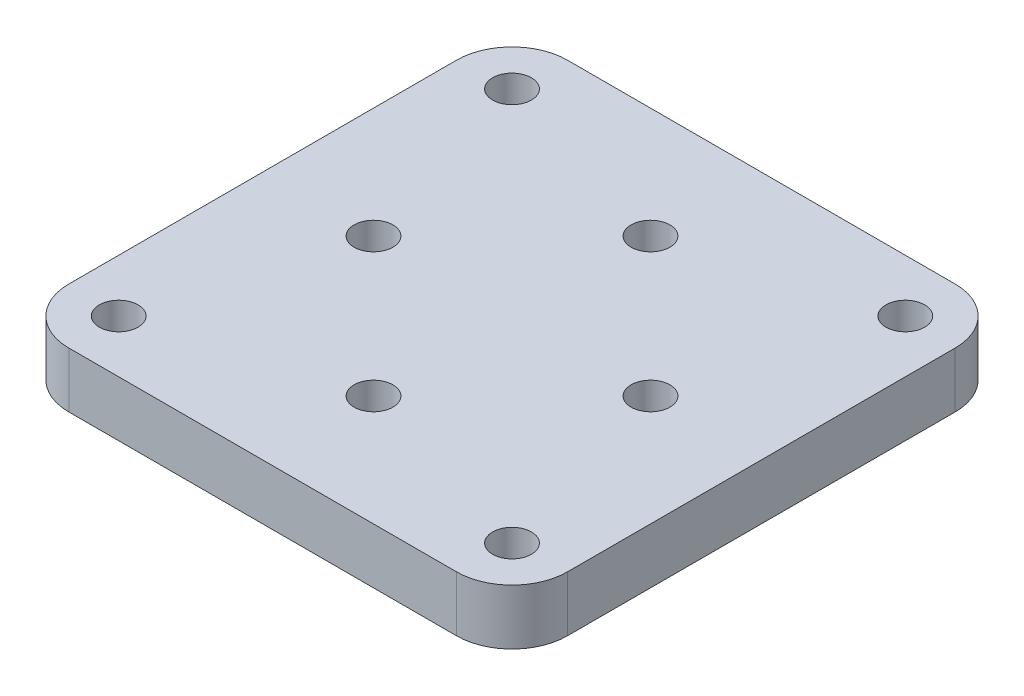
ISO-10303-21;
HEADER;
FILE_DESCRIPTION(('STEP AP214'),'2;1');
FILE_NAME('part.step','',(''),(''),'','','');
FILE_SCHEMA(('AUTOMOTIVE_DESIGN { 1 0 10303 214 1 1 1 1 }'));
ENDSEC;
DATA;
#1=APPLICATION_CONTEXT('core data for automotive mechanical design processes');
#2=APPLICATION_PROTOCOL_DEFINITION('international standard','automotive_design',2000,#1);
#3=PRODUCT_CONTEXT('',#1,'mechanical');
#4=PRODUCT('Part','Part','',(#3));
#5=PRODUCT_RELATED_PRODUCT_CATEGORY('part','',(#4));
#6=PRODUCT_DEFINITION_FORMATION('','',#4);
#7=PRODUCT_DEFINITION_CONTEXT('part definition',#1,'design');
#8=PRODUCT_DEFINITION('design','',#6,#7);
#9=PRODUCT_DEFINITION_SHAPE('','',#8);
#10=(LENGTH_UNIT() NAMED_UNIT(*) SI_UNIT(.MILLI.,.METRE.));
#11=(NAMED_UNIT(*) PLANE_ANGLE_UNIT() SI_UNIT($,.RADIAN.));
#12=(NAMED_UNIT(*) SI_UNIT($,.STERADIAN.) SOLID_ANGLE_UNIT());
#13=UNCERTAINTY_MEASURE_WITH_UNIT(LENGTH_MEASURE(1.E-05),#10,'distance_accuracy_value','');
#14=(GEOMETRIC_REPRESENTATION_CONTEXT(3) GLOBAL_UNCERTAINTY_ASSIGNED_CONTEXT((#13)) GLOBAL_UNIT_ASSIGNED_CONTEXT((#10,
#11,#12)) REPRESENTATION_CONTEXT('',''));
#15=CARTESIAN_POINT('',(0.,0.,0.));
#16=DIRECTION('',(0.,0.,1.));
#17=DIRECTION('',(1.,0.,0.));
#18=AXIS2_PLACEMENT_3D('',#15,#16,#17);
#19=CARTESIAN_POINT('',(45.,10.,-45.));
#20=DIRECTION('',(-1.,0.,0.));
#21=DIRECTION('',(0.,0.,1.));
#22=AXIS2_PLACEMENT_3D('',#19,#20,#21);
#23=PLANE('',#22);
#24=DIRECTION('',(0.,0.,-1.));
#25=VECTOR('',#24,1.);
#26=CARTESIAN_POINT('',(45.,0.,-45.));
#27=LINE('',#26,#25);
#28=CARTESIAN_POINT('',(45.,0.,35.));
#29=VERTEX_POINT('',#28);
#30=CARTESIAN_POINT('',(45.,0.,-35.));
#31=VERTEX_POINT('',#30);
#32=EDGE_CURVE('E130',#29,#31,#27,.T.);
#33=ORIENTED_EDGE('',*,*,#32,.T.);
#34=DIRECTION('',(0.,-1.,0.));
#35=VECTOR('',#34,1.);
#36=CARTESIAN_POINT('',(45.,10.,-35.));
#37=LINE('',#36,#35);
#38=CARTESIAN_POINT('',(45.,10.,-35.));
#39=VERTEX_POINT('',#38);
#40=EDGE_CURVE('E108',#31,#39,#37,.F.);
#41=ORIENTED_EDGE('',*,*,#40,.T.);
#42=DIRECTION('',(0.,0.,-1.));
#43=VECTOR('',#42,1.);
#44=CARTESIAN_POINT('',(45.,10.,-45.));
#45=LINE('',#44,#43);
#46=CARTESIAN_POINT('',(45.,10.,35.));
#47=VERTEX_POINT('',#46);
#48=EDGE_CURVE('E140',#47,#39,#45,.T.);
#49=ORIENTED_EDGE('',*,*,#48,.F.);
#50=DIRECTION('',(0.,-1.,0.));
#51=VECTOR('',#50,1.);
#52=CARTESIAN_POINT('',(45.,10.,35.));
#53=LINE('',#52,#51);
#54=EDGE_CURVE('E113',#47,#29,#53,.T.);
#55=ORIENTED_EDGE('',*,*,#54,.T.);
#56=EDGE_LOOP('',(#33,#41,#49,#55));
#57=FACE_BOUND('',#56,.T.);
#58=ADVANCED_FACE('F38',(#57),#23,.F.);
#59=CARTESIAN_POINT('',(-45.,10.,-45.));
#60=DIRECTION('',(0.,0.,1.));
#61=DIRECTION('',(1.,0.,0.));
#62=AXIS2_PLACEMENT_3D('',#59,#60,#61);
#63=PLANE('',#62);
#64=DIRECTION('',(-1.,0.,0.));
#65=VECTOR('',#64,1.);
#66=CARTESIAN_POINT('',(-45.,10.,-45.));
#67=LINE('',#66,#65);
#68=CARTESIAN_POINT('',(35.,10.,-45.));
#69=VERTEX_POINT('',#68);
#70=CARTESIAN_POINT('',(-35.,10.,-45.));
#71=VERTEX_POINT('',#70);
#72=EDGE_CURVE('E123',#69,#71,#67,.T.);
#73=ORIENTED_EDGE('',*,*,#72,.F.);
#74=DIRECTION('',(0.,-1.,0.));
#75=VECTOR('',#74,1.);
#76=CARTESIAN_POINT('',(35.,10.,-45.));
#77=LINE('',#76,#75);
#78=CARTESIAN_POINT('',(35.,0.,-45.));
#79=VERTEX_POINT('',#78);
#80=EDGE_CURVE('E107',#69,#79,#77,.T.);
#81=ORIENTED_EDGE('',*,*,#80,.T.);
#82=DIRECTION('',(-1.,0.,0.));
#83=VECTOR('',#82,1.);
#84=CARTESIAN_POINT('',(-45.,0.,-45.));
#85=LINE('',#84,#83);
#86=CARTESIAN_POINT('',(-35.,0.,-45.));
#87=VERTEX_POINT('',#86);
#88=EDGE_CURVE('E120',#79,#87,#85,.T.);
#89=ORIENTED_EDGE('',*,*,#88,.T.);
#90=DIRECTION('',(0.,-1.,0.));
#91=VECTOR('',#90,1.);
#92=CARTESIAN_POINT('',(-35.,10.,-45.));
#93=LINE('',#92,#91);
#94=EDGE_CURVE('E125',#87,#71,#93,.F.);
#95=ORIENTED_EDGE('',*,*,#94,.T.);
#96=EDGE_LOOP('',(#73,#81,#89,#95));
#97=FACE_BOUND('',#96,.T.);
#98=ADVANCED_FACE('F119',(#97),#63,.F.);
#99=CARTESIAN_POINT('',(-45.,10.,-45.));
#100=DIRECTION('',(1.,0.,0.));
#101=DIRECTION('',(0.,0.,-1.));
#102=AXIS2_PLACEMENT_3D('',#99,#100,#101);
#103=PLANE('',#102);
#104=DIRECTION('',(0.,0.,1.));
#105=VECTOR('',#104,1.);
#106=CARTESIAN_POINT('',(-45.,10.,-45.));
#107=LINE('',#106,#105);
#108=CARTESIAN_POINT('',(-45.,10.,-35.));
#109=VERTEX_POINT('',#108);
#110=CARTESIAN_POINT('',(-45.,10.,35.));
#111=VERTEX_POINT('',#110);
#112=EDGE_CURVE('E161',#109,#111,#107,.T.);
#113=ORIENTED_EDGE('',*,*,#112,.F.);
#114=DIRECTION('',(0.,-1.,0.));
#115=VECTOR('',#114,1.);
#116=CARTESIAN_POINT('',(-45.,10.,-35.));
#117=LINE('',#116,#115);
#118=CARTESIAN_POINT('',(-45.,0.,-35.));
#119=VERTEX_POINT('',#118);
#120=EDGE_CURVE('E183',#109,#119,#117,.T.);
#121=ORIENTED_EDGE('',*,*,#120,.T.);
#122=DIRECTION('',(0.,0.,1.));
#123=VECTOR('',#122,1.);
#124=CARTESIAN_POINT('',(-45.,0.,-45.));
#125=LINE('',#124,#123);
#126=CARTESIAN_POINT('',(-45.,0.,35.));
#127=VERTEX_POINT('',#126);
#128=EDGE_CURVE('E129',#119,#127,#125,.T.);
#129=ORIENTED_EDGE('',*,*,#128,.T.);
#130=DIRECTION('',(0.,-1.,0.));
#131=VECTOR('',#130,1.);
#132=CARTESIAN_POINT('',(-45.,10.,35.));
#133=LINE('',#132,#131);
#134=EDGE_CURVE('E181',#127,#111,#133,.F.);
#135=ORIENTED_EDGE('',*,*,#134,.T.);
#136=EDGE_LOOP('',(#113,#121,#129,#135));
#137=FACE_BOUND('',#136,.T.);
#138=ADVANCED_FACE('F213',(#137),#103,.F.);
#139=CARTESIAN_POINT('',(-45.,10.,45.));
#140=DIRECTION('',(0.,0.,-1.));
#141=DIRECTION('',(-1.,0.,0.));
#142=AXIS2_PLACEMENT_3D('',#139,#140,#141);
#143=PLANE('',#142);
#144=DIRECTION('',(1.,0.,0.));
#145=VECTOR('',#144,1.);
#146=CARTESIAN_POINT('',(-45.,0.,45.));
#147=LINE('',#146,#145);
#148=CARTESIAN_POINT('',(-35.,0.,45.));
#149=VERTEX_POINT('',#148);
#150=CARTESIAN_POINT('',(35.,0.,45.));
#151=VERTEX_POINT('',#150);
#152=EDGE_CURVE('E133',#149,#151,#147,.T.);
#153=ORIENTED_EDGE('',*,*,#152,.T.);
#154=DIRECTION('',(0.,-1.,0.));
#155=VECTOR('',#154,1.);
#156=CARTESIAN_POINT('',(35.,10.,45.));
#157=LINE('',#156,#155);
#158=CARTESIAN_POINT('',(35.,10.,45.));
#159=VERTEX_POINT('',#158);
#160=EDGE_CURVE('E12',#151,#159,#157,.F.);
#161=ORIENTED_EDGE('',*,*,#160,.T.);
#162=DIRECTION('',(1.,0.,0.));
#163=VECTOR('',#162,1.);
#164=CARTESIAN_POINT('',(-45.,10.,45.));
#165=LINE('',#164,#163);
#166=CARTESIAN_POINT('',(-35.,10.,45.));
#167=VERTEX_POINT('',#166);
#168=EDGE_CURVE('E141',#167,#159,#165,.T.);
#169=ORIENTED_EDGE('',*,*,#168,.F.);
#170=DIRECTION('',(0.,-1.,0.));
#171=VECTOR('',#170,1.);
#172=CARTESIAN_POINT('',(-35.,10.,45.));
#173=LINE('',#172,#171);
#174=EDGE_CURVE('E46',#167,#149,#173,.T.);
#175=ORIENTED_EDGE('',*,*,#174,.T.);
#176=EDGE_LOOP('',(#153,#161,#169,#175));
#177=FACE_BOUND('',#176,.T.);
#178=ADVANCED_FACE('F188',(#177),#143,.F.);
#179=CARTESIAN_POINT('',(0.,10.,0.));
#180=DIRECTION('',(0.,1.,0.));
#181=DIRECTION('',(0.,0.,1.));
#182=AXIS2_PLACEMENT_3D('',#179,#180,#181);
#183=PLANE('',#182);
#184=CARTESIAN_POINT('',(-35.5,10.,-35.5));
#185=DIRECTION('',(0.,1.,0.));
#186=DIRECTION('',(0.,0.,1.));
#187=AXIS2_PLACEMENT_3D('',#184,#185,#186);
#188=CIRCLE('',#187,3.49999999999999);
#189=CARTESIAN_POINT('',(-35.5,10.,-32.));
#190=VERTEX_POINT('',#189);
#191=EDGE_CURVE('E428',#190,#190,#188,.T.);
#192=ORIENTED_EDGE('',*,*,#191,.F.);
#193=EDGE_LOOP('',(#192));
#194=FACE_BOUND('',#193,.T.);
#195=CARTESIAN_POINT('',(-35.5,10.,35.5));
#196=DIRECTION('',(0.,1.,0.));
#197=DIRECTION('',(0.,0.,1.));
#198=AXIS2_PLACEMENT_3D('',#195,#196,#197);
#199=CIRCLE('',#198,3.49999999999999);
#200=CARTESIAN_POINT('',(-35.5,10.,39.));
#201=VERTEX_POINT('',#200);
#202=EDGE_CURVE('E420',#201,#201,#199,.T.);
#203=ORIENTED_EDGE('',*,*,#202,.F.);
#204=EDGE_LOOP('',(#203));
#205=FACE_BOUND('',#204,.T.);
#206=CARTESIAN_POINT('',(35.5,10.,-35.5));
#207=DIRECTION('',(0.,1.,0.));
#208=DIRECTION('',(0.,0.,1.));
#209=AXIS2_PLACEMENT_3D('',#206,#207,#208);
#210=CIRCLE('',#209,3.49999999999999);
#211=CARTESIAN_POINT('',(35.5,10.,-32.));
#212=VERTEX_POINT('',#211);
#213=EDGE_CURVE('E412',#212,#212,#210,.T.);
#214=ORIENTED_EDGE('',*,*,#213,.F.);
#215=EDGE_LOOP('',(#214));
#216=FACE_BOUND('',#215,.T.);
#217=CARTESIAN_POINT('',(35.5,10.,35.5));
#218=DIRECTION('',(0.,1.,0.));
#219=DIRECTION('',(0.,0.,1.));
#220=AXIS2_PLACEMENT_3D('',#217,#218,#219);
#221=CIRCLE('',#220,3.49999999999999);
#222=CARTESIAN_POINT('',(35.5,10.,39.));
#223=VERTEX_POINT('',#222);
#224=EDGE_CURVE('E405',#223,#223,#221,.T.);
#225=ORIENTED_EDGE('',*,*,#224,.F.);
#226=EDGE_LOOP('',(#225));
#227=FACE_BOUND('',#226,.T.);
#228=CARTESIAN_POINT('',(0.,10.,-25.));
#229=DIRECTION('',(0.,1.,0.));
#230=DIRECTION('',(0.,0.,1.));
#231=AXIS2_PLACEMENT_3D('',#228,#229,#230);
#232=CIRCLE('',#231,3.5);
#233=CARTESIAN_POINT('',(0.,10.,-21.5));
#234=VERTEX_POINT('',#233);
#235=EDGE_CURVE('E394',#234,#234,#232,.T.);
#236=ORIENTED_EDGE('',*,*,#235,.F.);
#237=EDGE_LOOP('',(#236));
#238=FACE_BOUND('',#237,.T.);
#239=CARTESIAN_POINT('',(25.,10.,0.));
#240=DIRECTION('',(0.,1.,0.));
#241=DIRECTION('',(0.,0.,1.));
#242=AXIS2_PLACEMENT_3D('',#239,#240,#241);
#243=CIRCLE('',#242,3.5);
#244=CARTESIAN_POINT('',(25.,10.,3.5));
#245=VERTEX_POINT('',#244);
#246=EDGE_CURVE('E386',#245,#245,#243,.T.);
#247=ORIENTED_EDGE('',*,*,#246,.F.);
#248=EDGE_LOOP('',(#247));
#249=FACE_BOUND('',#248,.T.);
#250=CARTESIAN_POINT('',(0.,10.,25.));
#251=DIRECTION('',(0.,1.,0.));
#252=DIRECTION('',(0.,0.,1.));
#253=AXIS2_PLACEMENT_3D('',#250,#251,#252);
#254=CIRCLE('',#253,3.5);
#255=CARTESIAN_POINT('',(0.,10.,28.5));
#256=VERTEX_POINT('',#255);
#257=EDGE_CURVE('E372',#256,#256,#254,.T.);
#258=ORIENTED_EDGE('',*,*,#257,.F.);
#259=EDGE_LOOP('',(#258));
#260=FACE_BOUND('',#259,.T.);
#261=CARTESIAN_POINT('',(-25.,10.,0.));
#262=DIRECTION('',(0.,1.,0.));
#263=DIRECTION('',(0.,0.,1.));
#264=AXIS2_PLACEMENT_3D('',#261,#262,#263);
#265=CIRCLE('',#264,3.5);
#266=CARTESIAN_POINT('',(-25.,10.,3.5));
#267=VERTEX_POINT('',#266);
#268=EDGE_CURVE('E199',#267,#267,#265,.T.);
#269=ORIENTED_EDGE('',*,*,#268,.F.);
#270=EDGE_LOOP('',(#269));
#271=FACE_BOUND('',#270,.T.);
#272=ORIENTED_EDGE('',*,*,#48,.T.);
#273=CARTESIAN_POINT('',(35.,10.,-35.));
#274=DIRECTION('',(0.,1.,0.));
#275=DIRECTION('',(0.,0.,1.));
#276=AXIS2_PLACEMENT_3D('',#273,#274,#275);
#277=CIRCLE('',#276,10.);
#278=EDGE_CURVE('E177',#39,#69,#277,.T.);
#279=ORIENTED_EDGE('',*,*,#278,.T.);
#280=ORIENTED_EDGE('',*,*,#72,.T.);
#281=CARTESIAN_POINT('',(-35.,10.,-35.));
#282=DIRECTION('',(0.,1.,0.));
#283=DIRECTION('',(0.,0.,1.));
#284=AXIS2_PLACEMENT_3D('',#281,#282,#283);
#285=CIRCLE('',#284,10.);
#286=EDGE_CURVE('E174',#71,#109,#285,.T.);
#287=ORIENTED_EDGE('',*,*,#286,.T.);
#288=ORIENTED_EDGE('',*,*,#112,.T.);
#289=CARTESIAN_POINT('',(-35.,10.,35.));
#290=DIRECTION('',(0.,1.,0.));
#291=DIRECTION('',(0.,0.,1.));
#292=AXIS2_PLACEMENT_3D('',#289,#290,#291);
#293=CIRCLE('',#292,10.);
#294=EDGE_CURVE('E58',#111,#167,#293,.T.);
#295=ORIENTED_EDGE('',*,*,#294,.T.);
#296=ORIENTED_EDGE('',*,*,#168,.T.);
#297=CARTESIAN_POINT('',(35.,10.,35.));
#298=DIRECTION('',(0.,1.,0.));
#299=DIRECTION('',(0.,0.,1.));
#300=AXIS2_PLACEMENT_3D('',#297,#298,#299);
#301=CIRCLE('',#300,10.);
#302=EDGE_CURVE('E152',#159,#47,#301,.T.);
#303=ORIENTED_EDGE('',*,*,#302,.T.);
#304=EDGE_LOOP('',(#272,#279,#280,#287,#288,#295,#296,#303));
#305=FACE_BOUND('',#304,.T.);
#306=ADVANCED_FACE('F202',(#194,#205,#216,#227,#238,#249,#260,#271,#305),#183,.T.);
#307=CARTESIAN_POINT('',(0.,0.,0.));
#308=DIRECTION('',(0.,1.,0.));
#309=DIRECTION('',(0.,0.,1.));
#310=AXIS2_PLACEMENT_3D('',#307,#308,#309);
#311=PLANE('',#310);
#312=CARTESIAN_POINT('',(-35.5,0.,-35.5));
#313=DIRECTION('',(0.,1.,0.));
#314=DIRECTION('',(0.,0.,1.));
#315=AXIS2_PLACEMENT_3D('',#312,#313,#314);
#316=CIRCLE('',#315,3.49999999999998);
#317=CARTESIAN_POINT('',(-35.5,0.,-32.));
#318=VERTEX_POINT('',#317);
#319=EDGE_CURVE('E425',#318,#318,#316,.T.);
#320=ORIENTED_EDGE('',*,*,#319,.T.);
#321=EDGE_LOOP('',(#320));
#322=FACE_BOUND('',#321,.T.);
#323=CARTESIAN_POINT('',(-35.5,0.,35.5));
#324=DIRECTION('',(0.,1.,0.));
#325=DIRECTION('',(0.,0.,1.));
#326=AXIS2_PLACEMENT_3D('',#323,#324,#325);
#327=CIRCLE('',#326,3.49999999999998);
#328=CARTESIAN_POINT('',(-35.5,0.,39.));
#329=VERTEX_POINT('',#328);
#330=EDGE_CURVE('E417',#329,#329,#327,.T.);
#331=ORIENTED_EDGE('',*,*,#330,.T.);
#332=EDGE_LOOP('',(#331));
#333=FACE_BOUND('',#332,.T.);
#334=CARTESIAN_POINT('',(35.5,0.,-35.5));
#335=DIRECTION('',(0.,1.,0.));
#336=DIRECTION('',(0.,0.,1.));
#337=AXIS2_PLACEMENT_3D('',#334,#335,#336);
#338=CIRCLE('',#337,3.49999999999998);
#339=CARTESIAN_POINT('',(35.5,0.,-32.));
#340=VERTEX_POINT('',#339);
#341=EDGE_CURVE('E410',#340,#340,#338,.T.);
#342=ORIENTED_EDGE('',*,*,#341,.T.);
#343=EDGE_LOOP('',(#342));
#344=FACE_BOUND('',#343,.T.);
#345=CARTESIAN_POINT('',(35.5,0.,35.5));
#346=DIRECTION('',(0.,1.,0.));
#347=DIRECTION('',(0.,0.,1.));
#348=AXIS2_PLACEMENT_3D('',#345,#346,#347);
#349=CIRCLE('',#348,3.49999999999998);
#350=CARTESIAN_POINT('',(35.5,0.,39.));
#351=VERTEX_POINT('',#350);
#352=EDGE_CURVE('E399',#351,#351,#349,.T.);
#353=ORIENTED_EDGE('',*,*,#352,.T.);
#354=EDGE_LOOP('',(#353));
#355=FACE_BOUND('',#354,.T.);
#356=CARTESIAN_POINT('',(0.,0.,-25.));
#357=DIRECTION('',(0.,1.,0.));
#358=DIRECTION('',(0.,0.,1.));
#359=AXIS2_PLACEMENT_3D('',#356,#357,#358);
#360=CIRCLE('',#359,3.5);
#361=CARTESIAN_POINT('',(0.,0.,-21.5));
#362=VERTEX_POINT('',#361);
#363=EDGE_CURVE('E391',#362,#362,#360,.T.);
#364=ORIENTED_EDGE('',*,*,#363,.T.);
#365=EDGE_LOOP('',(#364));
#366=FACE_BOUND('',#365,.T.);
#367=CARTESIAN_POINT('',(25.,0.,0.));
#368=DIRECTION('',(0.,1.,0.));
#369=DIRECTION('',(0.,0.,1.));
#370=AXIS2_PLACEMENT_3D('',#367,#368,#369);
#371=CIRCLE('',#370,3.5);
#372=CARTESIAN_POINT('',(25.,0.,3.5));
#373=VERTEX_POINT('',#372);
#374=EDGE_CURVE('E384',#373,#373,#371,.T.);
#375=ORIENTED_EDGE('',*,*,#374,.T.);
#376=EDGE_LOOP('',(#375));
#377=FACE_BOUND('',#376,.T.);
#378=CARTESIAN_POINT('',(0.,0.,25.));
#379=DIRECTION('',(0.,1.,0.));
#380=DIRECTION('',(0.,0.,1.));
#381=AXIS2_PLACEMENT_3D('',#378,#379,#380);
#382=CIRCLE('',#381,3.5);
#383=CARTESIAN_POINT('',(0.,0.,28.5));
#384=VERTEX_POINT('',#383);
#385=EDGE_CURVE('E369',#384,#384,#382,.T.);
#386=ORIENTED_EDGE('',*,*,#385,.T.);
#387=EDGE_LOOP('',(#386));
#388=FACE_BOUND('',#387,.T.);
#389=CARTESIAN_POINT('',(-25.,0.,0.));
#390=DIRECTION('',(0.,1.,0.));
#391=DIRECTION('',(0.,0.,1.));
#392=AXIS2_PLACEMENT_3D('',#389,#390,#391);
#393=CIRCLE('',#392,3.5);
#394=CARTESIAN_POINT('',(-25.,0.,3.5));
#395=VERTEX_POINT('',#394);
#396=EDGE_CURVE('E135',#395,#395,#393,.T.);
#397=ORIENTED_EDGE('',*,*,#396,.T.);
#398=EDGE_LOOP('',(#397));
#399=FACE_BOUND('',#398,.T.);
#400=ORIENTED_EDGE('',*,*,#88,.F.);
#401=CARTESIAN_POINT('',(35.,0.,-35.));
#402=DIRECTION('',(0.,1.,0.));
#403=DIRECTION('',(0.,0.,1.));
#404=AXIS2_PLACEMENT_3D('',#401,#402,#403);
#405=CIRCLE('',#404,10.);
#406=EDGE_CURVE('E103',#79,#31,#405,.F.);
#407=ORIENTED_EDGE('',*,*,#406,.T.);
#408=ORIENTED_EDGE('',*,*,#32,.F.);
#409=CARTESIAN_POINT('',(35.,0.,35.));
#410=DIRECTION('',(0.,1.,0.));
#411=DIRECTION('',(0.,0.,1.));
#412=AXIS2_PLACEMENT_3D('',#409,#410,#411);
#413=CIRCLE('',#412,10.);
#414=EDGE_CURVE('E144',#29,#151,#413,.F.);
#415=ORIENTED_EDGE('',*,*,#414,.T.);
#416=ORIENTED_EDGE('',*,*,#152,.F.);
#417=CARTESIAN_POINT('',(-35.,0.,35.));
#418=DIRECTION('',(0.,1.,0.));
#419=DIRECTION('',(0.,0.,1.));
#420=AXIS2_PLACEMENT_3D('',#417,#418,#419);
#421=CIRCLE('',#420,10.);
#422=EDGE_CURVE('E124',#149,#127,#421,.F.);
#423=ORIENTED_EDGE('',*,*,#422,.T.);
#424=ORIENTED_EDGE('',*,*,#128,.F.);
#425=CARTESIAN_POINT('',(-35.,0.,-35.));
#426=DIRECTION('',(0.,1.,0.));
#427=DIRECTION('',(0.,0.,1.));
#428=AXIS2_PLACEMENT_3D('',#425,#426,#427);
#429=CIRCLE('',#428,10.);
#430=EDGE_CURVE('E114',#119,#87,#429,.F.);
#431=ORIENTED_EDGE('',*,*,#430,.T.);
#432=EDGE_LOOP('',(#400,#407,#408,#415,#416,#423,#424,#431));
#433=FACE_BOUND('',#432,.T.);
#434=ADVANCED_FACE('F127',(#322,#333,#344,#355,#366,#377,#388,#399,#433),#311,.F.);
#435=CARTESIAN_POINT('',(-25.,10.,0.));
#436=DIRECTION('',(0.,1.,0.));
#437=DIRECTION('',(0.,0.,1.));
#438=AXIS2_PLACEMENT_3D('',#435,#436,#437);
#439=CYLINDRICAL_SURFACE('',#438,3.5);
#440=ORIENTED_EDGE('',*,*,#396,.F.);
#441=EDGE_LOOP('',(#440));
#442=FACE_BOUND('',#441,.T.);
#443=ORIENTED_EDGE('',*,*,#268,.T.);
#444=EDGE_LOOP('',(#443));
#445=FACE_BOUND('',#444,.T.);
#446=ADVANCED_FACE('F210',(#442,#445),#439,.F.);
#447=CARTESIAN_POINT('',(0.,10.,25.));
#448=DIRECTION('',(0.,1.,0.));
#449=DIRECTION('',(0.,0.,1.));
#450=AXIS2_PLACEMENT_3D('',#447,#448,#449);
#451=CYLINDRICAL_SURFACE('',#450,3.5);
#452=ORIENTED_EDGE('',*,*,#385,.F.);
#453=EDGE_LOOP('',(#452));
#454=FACE_BOUND('',#453,.T.);
#455=ORIENTED_EDGE('',*,*,#257,.T.);
#456=EDGE_LOOP('',(#455));
#457=FACE_BOUND('',#456,.T.);
#458=ADVANCED_FACE('F332',(#454,#457),#451,.F.);
#459=CARTESIAN_POINT('',(25.,10.,0.));
#460=DIRECTION('',(0.,1.,0.));
#461=DIRECTION('',(0.,0.,1.));
#462=AXIS2_PLACEMENT_3D('',#459,#460,#461);
#463=CYLINDRICAL_SURFACE('',#462,3.5);
#464=ORIENTED_EDGE('',*,*,#374,.F.);
#465=EDGE_LOOP('',(#464));
#466=FACE_BOUND('',#465,.T.);
#467=ORIENTED_EDGE('',*,*,#246,.T.);
#468=EDGE_LOOP('',(#467));
#469=FACE_BOUND('',#468,.T.);
#470=ADVANCED_FACE('F324',(#466,#469),#463,.F.);
#471=CARTESIAN_POINT('',(0.,10.,-25.));
#472=DIRECTION('',(0.,1.,0.));
#473=DIRECTION('',(0.,0.,1.));
#474=AXIS2_PLACEMENT_3D('',#471,#472,#473);
#475=CYLINDRICAL_SURFACE('',#474,3.5);
#476=ORIENTED_EDGE('',*,*,#363,.F.);
#477=EDGE_LOOP('',(#476));
#478=FACE_BOUND('',#477,.T.);
#479=ORIENTED_EDGE('',*,*,#235,.T.);
#480=EDGE_LOOP('',(#479));
#481=FACE_BOUND('',#480,.T.);
#482=ADVANCED_FACE('F316',(#478,#481),#475,.F.);
#483=CARTESIAN_POINT('',(35.5,10.,35.5));
#484=DIRECTION('',(0.,1.,0.));
#485=DIRECTION('',(0.,0.,1.));
#486=AXIS2_PLACEMENT_3D('',#483,#484,#485);
#487=CYLINDRICAL_SURFACE('',#486,3.49999999999999);
#488=ORIENTED_EDGE('',*,*,#352,.F.);
#489=EDGE_LOOP('',(#488));
#490=FACE_BOUND('',#489,.T.);
#491=ORIENTED_EDGE('',*,*,#224,.T.);
#492=EDGE_LOOP('',(#491));
#493=FACE_BOUND('',#492,.T.);
#494=ADVANCED_FACE('F308',(#490,#493),#487,.F.);
#495=CARTESIAN_POINT('',(35.5,10.,-35.5));
#496=DIRECTION('',(0.,1.,0.));
#497=DIRECTION('',(0.,0.,1.));
#498=AXIS2_PLACEMENT_3D('',#495,#496,#497);
#499=CYLINDRICAL_SURFACE('',#498,3.49999999999999);
#500=ORIENTED_EDGE('',*,*,#341,.F.);
#501=EDGE_LOOP('',(#500));
#502=FACE_BOUND('',#501,.T.);
#503=ORIENTED_EDGE('',*,*,#213,.T.);
#504=EDGE_LOOP('',(#503));
#505=FACE_BOUND('',#504,.T.);
#506=ADVANCED_FACE('F300',(#502,#505),#499,.F.);
#507=CARTESIAN_POINT('',(-35.5,10.,35.5));
#508=DIRECTION('',(0.,1.,0.));
#509=DIRECTION('',(0.,0.,1.));
#510=AXIS2_PLACEMENT_3D('',#507,#508,#509);
#511=CYLINDRICAL_SURFACE('',#510,3.49999999999999);
#512=ORIENTED_EDGE('',*,*,#330,.F.);
#513=EDGE_LOOP('',(#512));
#514=FACE_BOUND('',#513,.T.);
#515=ORIENTED_EDGE('',*,*,#202,.T.);
#516=EDGE_LOOP('',(#515));
#517=FACE_BOUND('',#516,.T.);
#518=ADVANCED_FACE('F293',(#514,#517),#511,.F.);
#519=CARTESIAN_POINT('',(-35.5,10.,-35.5));
#520=DIRECTION('',(0.,1.,0.));
#521=DIRECTION('',(0.,0.,1.));
#522=AXIS2_PLACEMENT_3D('',#519,#520,#521);
#523=CYLINDRICAL_SURFACE('',#522,3.49999999999999);
#524=ORIENTED_EDGE('',*,*,#319,.F.);
#525=EDGE_LOOP('',(#524));
#526=FACE_BOUND('',#525,.T.);
#527=ORIENTED_EDGE('',*,*,#191,.T.);
#528=EDGE_LOOP('',(#527));
#529=FACE_BOUND('',#528,.T.);
#530=ADVANCED_FACE('F229',(#526,#529),#523,.F.);
#531=CARTESIAN_POINT('',(35.,10.,-35.));
#532=DIRECTION('',(0.,-1.,0.));
#533=DIRECTION('',(0.,0.,-1.));
#534=AXIS2_PLACEMENT_3D('',#531,#532,#533);
#535=CYLINDRICAL_SURFACE('',#534,10.);
#536=ORIENTED_EDGE('',*,*,#278,.F.);
#537=ORIENTED_EDGE('',*,*,#40,.F.);
#538=ORIENTED_EDGE('',*,*,#406,.F.);
#539=ORIENTED_EDGE('',*,*,#80,.F.);
#540=EDGE_LOOP('',(#536,#537,#538,#539));
#541=FACE_BOUND('',#540,.T.);
#542=ADVANCED_FACE('F106',(#541),#535,.T.);
#543=CARTESIAN_POINT('',(-35.,10.,-35.));
#544=DIRECTION('',(0.,-1.,0.));
#545=DIRECTION('',(0.,0.,-1.));
#546=AXIS2_PLACEMENT_3D('',#543,#544,#545);
#547=CYLINDRICAL_SURFACE('',#546,10.);
#548=ORIENTED_EDGE('',*,*,#286,.F.);
#549=ORIENTED_EDGE('',*,*,#94,.F.);
#550=ORIENTED_EDGE('',*,*,#430,.F.);
#551=ORIENTED_EDGE('',*,*,#120,.F.);
#552=EDGE_LOOP('',(#548,#549,#550,#551));
#553=FACE_BOUND('',#552,.T.);
#554=ADVANCED_FACE('F228',(#553),#547,.T.);
#555=CARTESIAN_POINT('',(35.,10.,35.));
#556=DIRECTION('',(0.,-1.,0.));
#557=DIRECTION('',(0.,0.,-1.));
#558=AXIS2_PLACEMENT_3D('',#555,#556,#557);
#559=CYLINDRICAL_SURFACE('',#558,10.);
#560=ORIENTED_EDGE('',*,*,#302,.F.);
#561=ORIENTED_EDGE('',*,*,#160,.F.);
#562=ORIENTED_EDGE('',*,*,#414,.F.);
#563=ORIENTED_EDGE('',*,*,#54,.F.);
#564=EDGE_LOOP('',(#560,#561,#562,#563));
#565=FACE_BOUND('',#564,.T.);
#566=ADVANCED_FACE('F193',(#565),#559,.T.);
#567=CARTESIAN_POINT('',(-35.,10.,35.));
#568=DIRECTION('',(0.,-1.,0.));
#569=DIRECTION('',(0.,0.,-1.));
#570=AXIS2_PLACEMENT_3D('',#567,#568,#569);
#571=CYLINDRICAL_SURFACE('',#570,10.);
#572=ORIENTED_EDGE('',*,*,#294,.F.);
#573=ORIENTED_EDGE('',*,*,#134,.F.);
#574=ORIENTED_EDGE('',*,*,#422,.F.);
#575=ORIENTED_EDGE('',*,*,#174,.F.);
#576=EDGE_LOOP('',(#572,#573,#574,#575));
#577=FACE_BOUND('',#576,.T.);
#578=ADVANCED_FACE('F40',(#577),#571,.T.);
#579=CLOSED_SHELL('',(#58,#98,#138,#178,#306,#434,#446,#458,#470,#482,#494,#506,#518,#530,#542,
#554,#566,#578));
#580=MANIFOLD_SOLID_BREP('B2',#579);
#581=ADVANCED_BREP_SHAPE_REPRESENTATION('',(#18,#580),#14);
#582=SHAPE_DEFINITION_REPRESENTATION(#9,#581);
ENDSEC;
END-ISO-10303-21;
